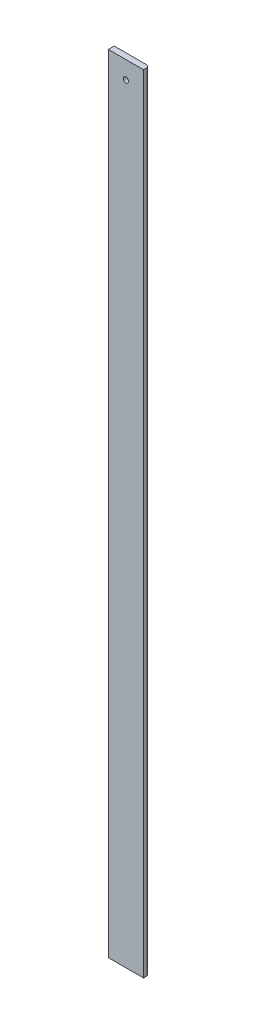
ISO-10303-21;
HEADER;
FILE_DESCRIPTION(('STEP AP214'),'2;1');
FILE_NAME('part.step','',(''),(''),'','','');
FILE_SCHEMA(('AUTOMOTIVE_DESIGN { 1 0 10303 214 1 1 1 1 }'));
ENDSEC;
DATA;
#1=APPLICATION_CONTEXT('core data for automotive mechanical design processes');
#2=APPLICATION_PROTOCOL_DEFINITION('international standard','automotive_design',2000,#1);
#3=PRODUCT_CONTEXT('',#1,'mechanical');
#4=PRODUCT('Part','Part','',(#3));
#5=PRODUCT_RELATED_PRODUCT_CATEGORY('part','',(#4));
#6=PRODUCT_DEFINITION_FORMATION('','',#4);
#7=PRODUCT_DEFINITION_CONTEXT('part definition',#1,'design');
#8=PRODUCT_DEFINITION('design','',#6,#7);
#9=PRODUCT_DEFINITION_SHAPE('','',#8);
#10=(LENGTH_UNIT() NAMED_UNIT(*) SI_UNIT(.MILLI.,.METRE.));
#11=(NAMED_UNIT(*) PLANE_ANGLE_UNIT() SI_UNIT($,.RADIAN.));
#12=(NAMED_UNIT(*) SI_UNIT($,.STERADIAN.) SOLID_ANGLE_UNIT());
#13=UNCERTAINTY_MEASURE_WITH_UNIT(LENGTH_MEASURE(1.E-05),#10,'distance_accuracy_value','');
#14=(GEOMETRIC_REPRESENTATION_CONTEXT(3) GLOBAL_UNCERTAINTY_ASSIGNED_CONTEXT((#13)) GLOBAL_UNIT_ASSIGNED_CONTEXT((#10,
#11,#12)) REPRESENTATION_CONTEXT('',''));
#15=CARTESIAN_POINT('',(0.,0.,0.));
#16=DIRECTION('',(0.,0.,1.));
#17=DIRECTION('',(1.,0.,0.));
#18=AXIS2_PLACEMENT_3D('',#15,#16,#17);
#19=CARTESIAN_POINT('',(0.,431.8,0.));
#20=DIRECTION('',(1.,0.,0.));
#21=DIRECTION('',(0.,0.,-1.));
#22=AXIS2_PLACEMENT_3D('',#19,#20,#21);
#23=PLANE('',#22);
#24=CARTESIAN_POINT('',(0.,109.5375,-11.1125));
#25=DIRECTION('',(1.,0.,0.));
#26=DIRECTION('',(0.,0.,-1.));
#27=AXIS2_PLACEMENT_3D('',#24,#25,#26);
#28=CIRCLE('',#27,1.4224);
#29=CARTESIAN_POINT('',(0.,109.5375,-12.5349));
#30=VERTEX_POINT('',#29);
#31=EDGE_CURVE('E217',#30,#30,#28,.T.);
#32=ORIENTED_EDGE('',*,*,#31,.T.);
#33=EDGE_LOOP('',(#32));
#34=FACE_BOUND('',#33,.T.);
#35=CARTESIAN_POINT('',(0.,395.2875,-11.1125));
#36=DIRECTION('',(1.,0.,0.));
#37=DIRECTION('',(0.,0.,-1.));
#38=AXIS2_PLACEMENT_3D('',#35,#36,#37);
#39=CIRCLE('',#38,1.42239999999999);
#40=CARTESIAN_POINT('',(0.,395.2875,-12.5349));
#41=VERTEX_POINT('',#40);
#42=EDGE_CURVE('E220',#41,#41,#39,.T.);
#43=ORIENTED_EDGE('',*,*,#42,.T.);
#44=EDGE_LOOP('',(#43));
#45=FACE_BOUND('',#44,.T.);
#46=CARTESIAN_POINT('',(0.,11.1125,-11.1125));
#47=DIRECTION('',(1.,0.,0.));
#48=DIRECTION('',(0.,0.,-1.));
#49=AXIS2_PLACEMENT_3D('',#46,#47,#48);
#50=CIRCLE('',#49,1.4224);
#51=CARTESIAN_POINT('',(0.,11.1125,-12.5349));
#52=VERTEX_POINT('',#51);
#53=EDGE_CURVE('E223',#52,#52,#50,.T.);
#54=ORIENTED_EDGE('',*,*,#53,.T.);
#55=EDGE_LOOP('',(#54));
#56=FACE_BOUND('',#55,.T.);
#57=CARTESIAN_POINT('',(0.,296.8625,-11.1125));
#58=DIRECTION('',(1.,0.,0.));
#59=DIRECTION('',(0.,0.,-1.));
#60=AXIS2_PLACEMENT_3D('',#57,#58,#59);
#61=CIRCLE('',#60,1.42239999999999);
#62=CARTESIAN_POINT('',(0.,296.8625,-12.5349));
#63=VERTEX_POINT('',#62);
#64=EDGE_CURVE('E226',#63,#63,#61,.T.);
#65=ORIENTED_EDGE('',*,*,#64,.T.);
#66=EDGE_LOOP('',(#65));
#67=FACE_BOUND('',#66,.T.);
#68=CARTESIAN_POINT('',(0.,203.2,-11.1125));
#69=DIRECTION('',(1.,0.,0.));
#70=DIRECTION('',(0.,0.,-1.));
#71=AXIS2_PLACEMENT_3D('',#68,#69,#70);
#72=CIRCLE('',#71,1.4224);
#73=CARTESIAN_POINT('',(0.,203.2,-12.5349));
#74=VERTEX_POINT('',#73);
#75=EDGE_CURVE('E229',#74,#74,#72,.T.);
#76=ORIENTED_EDGE('',*,*,#75,.T.);
#77=EDGE_LOOP('',(#76));
#78=FACE_BOUND('',#77,.T.);
#79=DIRECTION('',(0.,0.,1.));
#80=VECTOR('',#79,1.);
#81=CARTESIAN_POINT('',(0.,425.45,-3.175));
#82=LINE('',#81,#80);
#83=CARTESIAN_POINT('',(0.,425.45,-3.175));
#84=VERTEX_POINT('',#83);
#85=CARTESIAN_POINT('',(0.,425.45,0.));
#86=VERTEX_POINT('',#85);
#87=EDGE_CURVE('E112',#84,#86,#82,.T.);
#88=ORIENTED_EDGE('',*,*,#87,.F.);
#89=DIRECTION('',(0.,-1.,0.));
#90=VECTOR('',#89,1.);
#91=CARTESIAN_POINT('',(0.,431.8,-3.175));
#92=LINE('',#91,#90);
#93=CARTESIAN_POINT('',(0.,406.4,-3.175));
#94=VERTEX_POINT('',#93);
#95=EDGE_CURVE('E119',#84,#94,#92,.T.);
#96=ORIENTED_EDGE('',*,*,#95,.T.);
#97=DIRECTION('',(0.,0.,-1.));
#98=VECTOR('',#97,1.);
#99=CARTESIAN_POINT('',(0.,406.4,0.));
#100=LINE('',#99,#98);
#101=CARTESIAN_POINT('',(0.,406.4,-19.05));
#102=VERTEX_POINT('',#101);
#103=EDGE_CURVE('E131',#94,#102,#100,.T.);
#104=ORIENTED_EDGE('',*,*,#103,.T.);
#105=DIRECTION('',(0.,-1.,0.));
#106=VECTOR('',#105,1.);
#107=CARTESIAN_POINT('',(0.,431.8,-19.05));
#108=LINE('',#107,#106);
#109=CARTESIAN_POINT('',(0.,0.,-19.05));
#110=VERTEX_POINT('',#109);
#111=EDGE_CURVE('E57',#102,#110,#108,.T.);
#112=ORIENTED_EDGE('',*,*,#111,.T.);
#113=DIRECTION('',(0.,0.,1.));
#114=VECTOR('',#113,1.);
#115=CARTESIAN_POINT('',(0.,0.,0.));
#116=LINE('',#115,#114);
#117=CARTESIAN_POINT('',(0.,0.,0.));
#118=VERTEX_POINT('',#117);
#119=EDGE_CURVE('E138',#110,#118,#116,.T.);
#120=ORIENTED_EDGE('',*,*,#119,.T.);
#121=DIRECTION('',(0.,-1.,0.));
#122=VECTOR('',#121,1.);
#123=CARTESIAN_POINT('',(0.,431.8,0.));
#124=LINE('',#123,#122);
#125=EDGE_CURVE('E11',#86,#118,#124,.T.);
#126=ORIENTED_EDGE('',*,*,#125,.F.);
#127=EDGE_LOOP('',(#88,#96,#104,#112,#120,#126));
#128=FACE_BOUND('',#127,.T.);
#129=ADVANCED_FACE('F35',(#34,#45,#56,#67,#78,#128),#23,.F.);
#130=CARTESIAN_POINT('',(0.,431.8,0.));
#131=DIRECTION('',(0.,0.,-1.));
#132=DIRECTION('',(-1.,0.,0.));
#133=AXIS2_PLACEMENT_3D('',#130,#131,#132);
#134=PLANE('',#133);
#135=CARTESIAN_POINT('',(9.525,415.925,0.));
#136=DIRECTION('',(0.,0.,-1.));
#137=DIRECTION('',(-1.,0.,0.));
#138=AXIS2_PLACEMENT_3D('',#135,#136,#137);
#139=CIRCLE('',#138,1.42239999999999);
#140=CARTESIAN_POINT('',(8.10260000000001,415.925,0.));
#141=VERTEX_POINT('',#140);
#142=EDGE_CURVE('E193',#141,#141,#139,.T.);
#143=ORIENTED_EDGE('',*,*,#142,.T.);
#144=EDGE_LOOP('',(#143));
#145=FACE_BOUND('',#144,.T.);
#146=DIRECTION('',(1.,0.,0.));
#147=VECTOR('',#146,1.);
#148=CARTESIAN_POINT('',(0.,425.45,0.));
#149=LINE('',#148,#147);
#150=CARTESIAN_POINT('',(19.05,425.45,0.));
#151=VERTEX_POINT('',#150);
#152=EDGE_CURVE('E121',#86,#151,#149,.T.);
#153=ORIENTED_EDGE('',*,*,#152,.F.);
#154=ORIENTED_EDGE('',*,*,#125,.T.);
#155=DIRECTION('',(1.,0.,0.));
#156=VECTOR('',#155,1.);
#157=CARTESIAN_POINT('',(0.,0.,0.));
#158=LINE('',#157,#156);
#159=CARTESIAN_POINT('',(19.05,0.,0.));
#160=VERTEX_POINT('',#159);
#161=EDGE_CURVE('E140',#118,#160,#158,.T.);
#162=ORIENTED_EDGE('',*,*,#161,.T.);
#163=DIRECTION('',(0.,-1.,0.));
#164=VECTOR('',#163,1.);
#165=CARTESIAN_POINT('',(19.05,431.8,0.));
#166=LINE('',#165,#164);
#167=EDGE_CURVE('E42',#151,#160,#166,.T.);
#168=ORIENTED_EDGE('',*,*,#167,.F.);
#169=EDGE_LOOP('',(#153,#154,#162,#168));
#170=FACE_BOUND('',#169,.T.);
#171=ADVANCED_FACE('F185',(#145,#170),#134,.F.);
#172=CARTESIAN_POINT('',(19.05,431.8,-1.58749999999999));
#173=DIRECTION('',(-1.,0.,0.));
#174=DIRECTION('',(0.,0.,1.));
#175=AXIS2_PLACEMENT_3D('',#172,#173,#174);
#176=PLANE('',#175);
#177=DIRECTION('',(0.,0.,-1.));
#178=VECTOR('',#177,1.);
#179=CARTESIAN_POINT('',(19.05,425.45,0.));
#180=LINE('',#179,#178);
#181=CARTESIAN_POINT('',(19.05,425.45,-1.58749999999999));
#182=VERTEX_POINT('',#181);
#183=EDGE_CURVE('E182',#151,#182,#180,.T.);
#184=ORIENTED_EDGE('',*,*,#183,.F.);
#185=ORIENTED_EDGE('',*,*,#167,.T.);
#186=DIRECTION('',(0.,0.,-1.));
#187=VECTOR('',#186,1.);
#188=CARTESIAN_POINT('',(19.05,0.,-1.58749999999999));
#189=LINE('',#188,#187);
#190=CARTESIAN_POINT('',(19.05,0.,-1.58749999999999));
#191=VERTEX_POINT('',#190);
#192=EDGE_CURVE('E143',#160,#191,#189,.T.);
#193=ORIENTED_EDGE('',*,*,#192,.T.);
#194=DIRECTION('',(0.,-1.,0.));
#195=VECTOR('',#194,1.);
#196=CARTESIAN_POINT('',(19.05,431.8,-1.58749999999999));
#197=LINE('',#196,#195);
#198=EDGE_CURVE('E174',#182,#191,#197,.T.);
#199=ORIENTED_EDGE('',*,*,#198,.F.);
#200=EDGE_LOOP('',(#184,#185,#193,#199));
#201=FACE_BOUND('',#200,.T.);
#202=ADVANCED_FACE('F178',(#201),#176,.F.);
#203=CARTESIAN_POINT('',(17.4625,431.8,-1.5875));
#204=DIRECTION('',(0.,-1.,0.));
#205=DIRECTION('',(0.,0.,-1.));
#206=AXIS2_PLACEMENT_3D('',#203,#204,#205);
#207=CYLINDRICAL_SURFACE('',#206,1.5875);
#208=CARTESIAN_POINT('',(17.4625,425.45,-1.5875));
#209=DIRECTION('',(0.,1.,0.));
#210=DIRECTION('',(0.,0.,1.));
#211=AXIS2_PLACEMENT_3D('',#208,#209,#210);
#212=CIRCLE('',#211,1.5875);
#213=CARTESIAN_POINT('',(17.4625,425.45,-3.175));
#214=VERTEX_POINT('',#213);
#215=EDGE_CURVE('E49',#182,#214,#212,.T.);
#216=ORIENTED_EDGE('',*,*,#215,.F.);
#217=ORIENTED_EDGE('',*,*,#198,.T.);
#218=CARTESIAN_POINT('',(17.4625,0.,-1.5875));
#219=DIRECTION('',(0.,1.,0.));
#220=DIRECTION('',(0.,0.,-1.));
#221=AXIS2_PLACEMENT_3D('',#218,#219,#220);
#222=CIRCLE('',#221,1.5875);
#223=CARTESIAN_POINT('',(17.4625,0.,-3.175));
#224=VERTEX_POINT('',#223);
#225=EDGE_CURVE('E146',#191,#224,#222,.T.);
#226=ORIENTED_EDGE('',*,*,#225,.T.);
#227=DIRECTION('',(0.,-1.,0.));
#228=VECTOR('',#227,1.);
#229=CARTESIAN_POINT('',(17.4625,431.8,-3.175));
#230=LINE('',#229,#228);
#231=EDGE_CURVE('E172',#214,#224,#230,.T.);
#232=ORIENTED_EDGE('',*,*,#231,.F.);
#233=EDGE_LOOP('',(#216,#217,#226,#232));
#234=FACE_BOUND('',#233,.T.);
#235=ADVANCED_FACE('F192',(#234),#207,.T.);
#236=CARTESIAN_POINT('',(4.76250000000001,431.8,-3.175));
#237=DIRECTION('',(0.,0.,1.));
#238=DIRECTION('',(1.,0.,0.));
#239=AXIS2_PLACEMENT_3D('',#236,#237,#238);
#240=PLANE('',#239);
#241=CARTESIAN_POINT('',(9.525,415.925,-3.175));
#242=DIRECTION('',(0.,0.,-1.));
#243=DIRECTION('',(-1.,0.,0.));
#244=AXIS2_PLACEMENT_3D('',#241,#242,#243);
#245=CIRCLE('',#244,1.42239999999999);
#246=CARTESIAN_POINT('',(8.10260000000001,415.925,-3.175));
#247=VERTEX_POINT('',#246);
#248=EDGE_CURVE('E196',#247,#247,#245,.T.);
#249=ORIENTED_EDGE('',*,*,#248,.F.);
#250=EDGE_LOOP('',(#249));
#251=FACE_BOUND('',#250,.T.);
#252=DIRECTION('',(-1.,0.,0.));
#253=VECTOR('',#252,1.);
#254=CARTESIAN_POINT('',(17.4625,425.45,-3.175));
#255=LINE('',#254,#253);
#256=EDGE_CURVE('E109',#214,#84,#255,.T.);
#257=ORIENTED_EDGE('',*,*,#256,.F.);
#258=ORIENTED_EDGE('',*,*,#231,.T.);
#259=DIRECTION('',(-1.,0.,0.));
#260=VECTOR('',#259,1.);
#261=CARTESIAN_POINT('',(4.76250000000001,0.,-3.175));
#262=LINE('',#261,#260);
#263=CARTESIAN_POINT('',(4.76250000000001,0.,-3.175));
#264=VERTEX_POINT('',#263);
#265=EDGE_CURVE('E149',#224,#264,#262,.T.);
#266=ORIENTED_EDGE('',*,*,#265,.T.);
#267=DIRECTION('',(0.,-1.,0.));
#268=VECTOR('',#267,1.);
#269=CARTESIAN_POINT('',(4.76250000000001,431.8,-3.175));
#270=LINE('',#269,#268);
#271=CARTESIAN_POINT('',(4.7625,406.4,-3.175));
#272=VERTEX_POINT('',#271);
#273=EDGE_CURVE('E170',#272,#264,#270,.T.);
#274=ORIENTED_EDGE('',*,*,#273,.F.);
#275=DIRECTION('',(1.,0.,0.));
#276=VECTOR('',#275,1.);
#277=CARTESIAN_POINT('',(-3.175,406.4,-3.175));
#278=LINE('',#277,#276);
#279=EDGE_CURVE('E126',#94,#272,#278,.T.);
#280=ORIENTED_EDGE('',*,*,#279,.F.);
#281=ORIENTED_EDGE('',*,*,#95,.F.);
#282=EDGE_LOOP('',(#257,#258,#266,#274,#280,#281));
#283=FACE_BOUND('',#282,.T.);
#284=ADVANCED_FACE('F124',(#251,#283),#240,.F.);
#285=CARTESIAN_POINT('',(4.7625,431.8,-4.7625));
#286=DIRECTION('',(0.,-1.,0.));
#287=DIRECTION('',(0.,0.,-1.));
#288=AXIS2_PLACEMENT_3D('',#285,#286,#287);
#289=CYLINDRICAL_SURFACE('',#288,1.5875);
#290=DIRECTION('',(0.,-1.,0.));
#291=VECTOR('',#290,1.);
#292=CARTESIAN_POINT('',(3.175,431.8,-4.76250000000001));
#293=LINE('',#292,#291);
#294=CARTESIAN_POINT('',(3.175,406.4,-4.76250000000001));
#295=VERTEX_POINT('',#294);
#296=CARTESIAN_POINT('',(3.175,0.,-4.76250000000001));
#297=VERTEX_POINT('',#296);
#298=EDGE_CURVE('E168',#295,#297,#293,.T.);
#299=ORIENTED_EDGE('',*,*,#298,.F.);
#300=CARTESIAN_POINT('',(4.7625,406.4,-4.7625));
#301=DIRECTION('',(0.,-1.,0.));
#302=DIRECTION('',(0.,0.,-1.));
#303=AXIS2_PLACEMENT_3D('',#300,#301,#302);
#304=CIRCLE('',#303,1.5875);
#305=EDGE_CURVE('E232',#295,#272,#304,.F.);
#306=ORIENTED_EDGE('',*,*,#305,.T.);
#307=ORIENTED_EDGE('',*,*,#273,.T.);
#308=CARTESIAN_POINT('',(4.7625,0.,-4.7625));
#309=DIRECTION('',(0.,-1.,0.));
#310=DIRECTION('',(0.,0.,1.));
#311=AXIS2_PLACEMENT_3D('',#308,#309,#310);
#312=CIRCLE('',#311,1.5875);
#313=EDGE_CURVE('E152',#264,#297,#312,.T.);
#314=ORIENTED_EDGE('',*,*,#313,.T.);
#315=EDGE_LOOP('',(#299,#306,#307,#314));
#316=FACE_BOUND('',#315,.T.);
#317=ADVANCED_FACE('F241',(#316),#289,.F.);
#318=CARTESIAN_POINT('',(3.175,431.8,-4.76250000000001));
#319=DIRECTION('',(-1.,0.,0.));
#320=DIRECTION('',(0.,0.,1.));
#321=AXIS2_PLACEMENT_3D('',#318,#319,#320);
#322=PLANE('',#321);
#323=CARTESIAN_POINT('',(3.175,203.2,-11.1125));
#324=DIRECTION('',(1.,0.,0.));
#325=DIRECTION('',(0.,0.,-1.));
#326=AXIS2_PLACEMENT_3D('',#323,#324,#325);
#327=CIRCLE('',#326,1.4224);
#328=CARTESIAN_POINT('',(3.175,203.2,-12.5349));
#329=VERTEX_POINT('',#328);
#330=EDGE_CURVE('E209',#329,#329,#327,.T.);
#331=ORIENTED_EDGE('',*,*,#330,.F.);
#332=EDGE_LOOP('',(#331));
#333=FACE_BOUND('',#332,.T.);
#334=CARTESIAN_POINT('',(3.175,296.8625,-11.1125));
#335=DIRECTION('',(1.,0.,0.));
#336=DIRECTION('',(0.,0.,-1.));
#337=AXIS2_PLACEMENT_3D('',#334,#335,#336);
#338=CIRCLE('',#337,1.42239999999999);
#339=CARTESIAN_POINT('',(3.175,296.8625,-12.5349));
#340=VERTEX_POINT('',#339);
#341=EDGE_CURVE('E206',#340,#340,#338,.T.);
#342=ORIENTED_EDGE('',*,*,#341,.F.);
#343=EDGE_LOOP('',(#342));
#344=FACE_BOUND('',#343,.T.);
#345=CARTESIAN_POINT('',(3.175,11.1125,-11.1125));
#346=DIRECTION('',(1.,0.,0.));
#347=DIRECTION('',(0.,0.,-1.));
#348=AXIS2_PLACEMENT_3D('',#345,#346,#347);
#349=CIRCLE('',#348,1.4224);
#350=CARTESIAN_POINT('',(3.175,11.1125,-12.5349));
#351=VERTEX_POINT('',#350);
#352=EDGE_CURVE('E203',#351,#351,#349,.T.);
#353=ORIENTED_EDGE('',*,*,#352,.F.);
#354=EDGE_LOOP('',(#353));
#355=FACE_BOUND('',#354,.T.);
#356=CARTESIAN_POINT('',(3.175,395.2875,-11.1125));
#357=DIRECTION('',(1.,0.,0.));
#358=DIRECTION('',(0.,0.,-1.));
#359=AXIS2_PLACEMENT_3D('',#356,#357,#358);
#360=CIRCLE('',#359,1.42239999999999);
#361=CARTESIAN_POINT('',(3.175,395.2875,-12.5349));
#362=VERTEX_POINT('',#361);
#363=EDGE_CURVE('E202',#362,#362,#360,.T.);
#364=ORIENTED_EDGE('',*,*,#363,.F.);
#365=EDGE_LOOP('',(#364));
#366=FACE_BOUND('',#365,.T.);
#367=CARTESIAN_POINT('',(3.175,109.5375,-11.1125));
#368=DIRECTION('',(1.,0.,0.));
#369=DIRECTION('',(0.,0.,-1.));
#370=AXIS2_PLACEMENT_3D('',#367,#368,#369);
#371=CIRCLE('',#370,1.4224);
#372=CARTESIAN_POINT('',(3.175,109.5375,-12.5349));
#373=VERTEX_POINT('',#372);
#374=EDGE_CURVE('E212',#373,#373,#371,.T.);
#375=ORIENTED_EDGE('',*,*,#374,.F.);
#376=EDGE_LOOP('',(#375));
#377=FACE_BOUND('',#376,.T.);
#378=DIRECTION('',(0.,-1.,0.));
#379=VECTOR('',#378,1.);
#380=CARTESIAN_POINT('',(3.175,431.8,-17.4625));
#381=LINE('',#380,#379);
#382=CARTESIAN_POINT('',(3.175,406.4,-17.4625));
#383=VERTEX_POINT('',#382);
#384=CARTESIAN_POINT('',(3.175,0.,-17.4625));
#385=VERTEX_POINT('',#384);
#386=EDGE_CURVE('E166',#383,#385,#381,.T.);
#387=ORIENTED_EDGE('',*,*,#386,.F.);
#388=DIRECTION('',(0.,0.,-1.));
#389=VECTOR('',#388,1.);
#390=CARTESIAN_POINT('',(3.175,406.4,-19.05));
#391=LINE('',#390,#389);
#392=EDGE_CURVE('E235',#295,#383,#391,.T.);
#393=ORIENTED_EDGE('',*,*,#392,.F.);
#394=ORIENTED_EDGE('',*,*,#298,.T.);
#395=DIRECTION('',(0.,0.,-1.));
#396=VECTOR('',#395,1.);
#397=CARTESIAN_POINT('',(3.175,0.,-4.76250000000001));
#398=LINE('',#397,#396);
#399=EDGE_CURVE('E155',#297,#385,#398,.T.);
#400=ORIENTED_EDGE('',*,*,#399,.T.);
#401=EDGE_LOOP('',(#387,#393,#394,#400));
#402=FACE_BOUND('',#401,.T.);
#403=ADVANCED_FACE('F247',(#333,#344,#355,#366,#377,#402),#322,.F.);
#404=CARTESIAN_POINT('',(1.5875,431.8,-17.4625));
#405=DIRECTION('',(0.,-1.,0.));
#406=DIRECTION('',(0.,0.,-1.));
#407=AXIS2_PLACEMENT_3D('',#404,#405,#406);
#408=CYLINDRICAL_SURFACE('',#407,1.5875);
#409=DIRECTION('',(0.,-1.,0.));
#410=VECTOR('',#409,1.);
#411=CARTESIAN_POINT('',(1.58749999999999,431.8,-19.05));
#412=LINE('',#411,#410);
#413=CARTESIAN_POINT('',(1.58749999999999,406.4,-19.05));
#414=VERTEX_POINT('',#413);
#415=CARTESIAN_POINT('',(1.58749999999999,0.,-19.05));
#416=VERTEX_POINT('',#415);
#417=EDGE_CURVE('E164',#414,#416,#412,.T.);
#418=ORIENTED_EDGE('',*,*,#417,.F.);
#419=CARTESIAN_POINT('',(1.5875,406.4,-17.4625));
#420=DIRECTION('',(0.,-1.,0.));
#421=DIRECTION('',(0.,0.,-1.));
#422=AXIS2_PLACEMENT_3D('',#419,#420,#421);
#423=CIRCLE('',#422,1.5875);
#424=EDGE_CURVE('E127',#414,#383,#423,.T.);
#425=ORIENTED_EDGE('',*,*,#424,.T.);
#426=ORIENTED_EDGE('',*,*,#386,.T.);
#427=CARTESIAN_POINT('',(1.5875,0.,-17.4625));
#428=DIRECTION('',(0.,1.,0.));
#429=DIRECTION('',(0.,0.,1.));
#430=AXIS2_PLACEMENT_3D('',#427,#428,#429);
#431=CIRCLE('',#430,1.5875);
#432=EDGE_CURVE('E158',#385,#416,#431,.T.);
#433=ORIENTED_EDGE('',*,*,#432,.T.);
#434=EDGE_LOOP('',(#418,#425,#426,#433));
#435=FACE_BOUND('',#434,.T.);
#436=ADVANCED_FACE('F250',(#435),#408,.T.);
#437=CARTESIAN_POINT('',(0.,431.8,-19.05));
#438=DIRECTION('',(0.,0.,1.));
#439=DIRECTION('',(1.,0.,0.));
#440=AXIS2_PLACEMENT_3D('',#437,#438,#439);
#441=PLANE('',#440);
#442=ORIENTED_EDGE('',*,*,#111,.F.);
#443=DIRECTION('',(1.,0.,0.));
#444=VECTOR('',#443,1.);
#445=CARTESIAN_POINT('',(-3.175,406.4,-19.05));
#446=LINE('',#445,#444);
#447=EDGE_CURVE('E128',#102,#414,#446,.T.);
#448=ORIENTED_EDGE('',*,*,#447,.T.);
#449=ORIENTED_EDGE('',*,*,#417,.T.);
#450=DIRECTION('',(-1.,0.,0.));
#451=VECTOR('',#450,1.);
#452=CARTESIAN_POINT('',(0.,0.,-19.05));
#453=LINE('',#452,#451);
#454=EDGE_CURVE('E161',#416,#110,#453,.T.);
#455=ORIENTED_EDGE('',*,*,#454,.T.);
#456=EDGE_LOOP('',(#442,#448,#449,#455));
#457=FACE_BOUND('',#456,.T.);
#458=ADVANCED_FACE('F252',(#457),#441,.F.);
#459=CARTESIAN_POINT('',(1.5875,0.,-17.4625));
#460=DIRECTION('',(0.,1.,0.));
#461=DIRECTION('',(0.,0.,1.));
#462=AXIS2_PLACEMENT_3D('',#459,#460,#461);
#463=PLANE('',#462);
#464=ORIENTED_EDGE('',*,*,#119,.F.);
#465=ORIENTED_EDGE('',*,*,#454,.F.);
#466=ORIENTED_EDGE('',*,*,#432,.F.);
#467=ORIENTED_EDGE('',*,*,#399,.F.);
#468=ORIENTED_EDGE('',*,*,#313,.F.);
#469=ORIENTED_EDGE('',*,*,#265,.F.);
#470=ORIENTED_EDGE('',*,*,#225,.F.);
#471=ORIENTED_EDGE('',*,*,#192,.F.);
#472=ORIENTED_EDGE('',*,*,#161,.F.);
#473=EDGE_LOOP('',(#464,#465,#466,#467,#468,#469,#470,#471,#472));
#474=FACE_BOUND('',#473,.T.);
#475=ADVANCED_FACE('F188',(#474),#463,.F.);
#476=CARTESIAN_POINT('',(-3.175,406.4,-19.05));
#477=DIRECTION('',(0.,-1.,0.));
#478=DIRECTION('',(0.,0.,-1.));
#479=AXIS2_PLACEMENT_3D('',#476,#477,#478);
#480=PLANE('',#479);
#481=ORIENTED_EDGE('',*,*,#279,.T.);
#482=ORIENTED_EDGE('',*,*,#305,.F.);
#483=ORIENTED_EDGE('',*,*,#392,.T.);
#484=ORIENTED_EDGE('',*,*,#424,.F.);
#485=ORIENTED_EDGE('',*,*,#447,.F.);
#486=ORIENTED_EDGE('',*,*,#103,.F.);
#487=EDGE_LOOP('',(#481,#482,#483,#484,#485,#486));
#488=FACE_BOUND('',#487,.T.);
#489=ADVANCED_FACE('F238',(#488),#480,.F.);
#490=CARTESIAN_POINT('',(-1.905,109.5375,-11.1125));
#491=DIRECTION('',(1.,0.,0.));
#492=DIRECTION('',(0.,0.,-1.));
#493=AXIS2_PLACEMENT_3D('',#490,#491,#492);
#494=CYLINDRICAL_SURFACE('',#493,1.4224);
#495=ORIENTED_EDGE('',*,*,#374,.T.);
#496=EDGE_LOOP('',(#495));
#497=FACE_BOUND('',#496,.T.);
#498=ORIENTED_EDGE('',*,*,#31,.F.);
#499=EDGE_LOOP('',(#498));
#500=FACE_BOUND('',#499,.T.);
#501=ADVANCED_FACE('F298',(#497,#500),#494,.F.);
#502=CARTESIAN_POINT('',(-1.905,395.2875,-11.1125));
#503=DIRECTION('',(1.,0.,0.));
#504=DIRECTION('',(0.,0.,-1.));
#505=AXIS2_PLACEMENT_3D('',#502,#503,#504);
#506=CYLINDRICAL_SURFACE('',#505,1.42239999999999);
#507=ORIENTED_EDGE('',*,*,#363,.T.);
#508=EDGE_LOOP('',(#507));
#509=FACE_BOUND('',#508,.T.);
#510=ORIENTED_EDGE('',*,*,#42,.F.);
#511=EDGE_LOOP('',(#510));
#512=FACE_BOUND('',#511,.T.);
#513=ADVANCED_FACE('F295',(#509,#512),#506,.F.);
#514=CARTESIAN_POINT('',(-1.905,11.1125,-11.1125));
#515=DIRECTION('',(1.,0.,0.));
#516=DIRECTION('',(0.,0.,-1.));
#517=AXIS2_PLACEMENT_3D('',#514,#515,#516);
#518=CYLINDRICAL_SURFACE('',#517,1.4224);
#519=ORIENTED_EDGE('',*,*,#352,.T.);
#520=EDGE_LOOP('',(#519));
#521=FACE_BOUND('',#520,.T.);
#522=ORIENTED_EDGE('',*,*,#53,.F.);
#523=EDGE_LOOP('',(#522));
#524=FACE_BOUND('',#523,.T.);
#525=ADVANCED_FACE('F291',(#521,#524),#518,.F.);
#526=CARTESIAN_POINT('',(-1.905,296.8625,-11.1125));
#527=DIRECTION('',(1.,0.,0.));
#528=DIRECTION('',(0.,0.,-1.));
#529=AXIS2_PLACEMENT_3D('',#526,#527,#528);
#530=CYLINDRICAL_SURFACE('',#529,1.42239999999999);
#531=ORIENTED_EDGE('',*,*,#341,.T.);
#532=EDGE_LOOP('',(#531));
#533=FACE_BOUND('',#532,.T.);
#534=ORIENTED_EDGE('',*,*,#64,.F.);
#535=EDGE_LOOP('',(#534));
#536=FACE_BOUND('',#535,.T.);
#537=ADVANCED_FACE('F282',(#533,#536),#530,.F.);
#538=CARTESIAN_POINT('',(-1.905,203.2,-11.1125));
#539=DIRECTION('',(1.,0.,0.));
#540=DIRECTION('',(0.,0.,-1.));
#541=AXIS2_PLACEMENT_3D('',#538,#539,#540);
#542=CYLINDRICAL_SURFACE('',#541,1.4224);
#543=ORIENTED_EDGE('',*,*,#330,.T.);
#544=EDGE_LOOP('',(#543));
#545=FACE_BOUND('',#544,.T.);
#546=ORIENTED_EDGE('',*,*,#75,.F.);
#547=EDGE_LOOP('',(#546));
#548=FACE_BOUND('',#547,.T.);
#549=ADVANCED_FACE('F280',(#545,#548),#542,.F.);
#550=CARTESIAN_POINT('',(17.4625,425.45,-1.5875));
#551=DIRECTION('',(0.,1.,0.));
#552=DIRECTION('',(0.,0.,1.));
#553=AXIS2_PLACEMENT_3D('',#550,#551,#552);
#554=PLANE('',#553);
#555=ORIENTED_EDGE('',*,*,#215,.T.);
#556=ORIENTED_EDGE('',*,*,#256,.T.);
#557=ORIENTED_EDGE('',*,*,#87,.T.);
#558=ORIENTED_EDGE('',*,*,#152,.T.);
#559=ORIENTED_EDGE('',*,*,#183,.T.);
#560=EDGE_LOOP('',(#555,#556,#557,#558,#559));
#561=FACE_BOUND('',#560,.T.);
#562=ADVANCED_FACE('F111',(#561),#554,.T.);
#563=CARTESIAN_POINT('',(9.525,415.925,1.905));
#564=DIRECTION('',(0.,0.,-1.));
#565=DIRECTION('',(-1.,0.,0.));
#566=AXIS2_PLACEMENT_3D('',#563,#564,#565);
#567=CYLINDRICAL_SURFACE('',#566,1.42239999999999);
#568=ORIENTED_EDGE('',*,*,#248,.T.);
#569=EDGE_LOOP('',(#568));
#570=FACE_BOUND('',#569,.T.);
#571=ORIENTED_EDGE('',*,*,#142,.F.);
#572=EDGE_LOOP('',(#571));
#573=FACE_BOUND('',#572,.T.);
#574=ADVANCED_FACE('F289',(#570,#573),#567,.F.);
#575=CLOSED_SHELL('',(#129,#171,#202,#235,#284,#317,#403,#436,#458,#475,#489,#501,#513,#525,
#537,#549,#562,#574));
#576=MANIFOLD_SOLID_BREP('B2',#575);
#577=ADVANCED_BREP_SHAPE_REPRESENTATION('',(#18,#576),#14);
#578=SHAPE_DEFINITION_REPRESENTATION(#9,#577);
ENDSEC;
END-ISO-10303-21;
